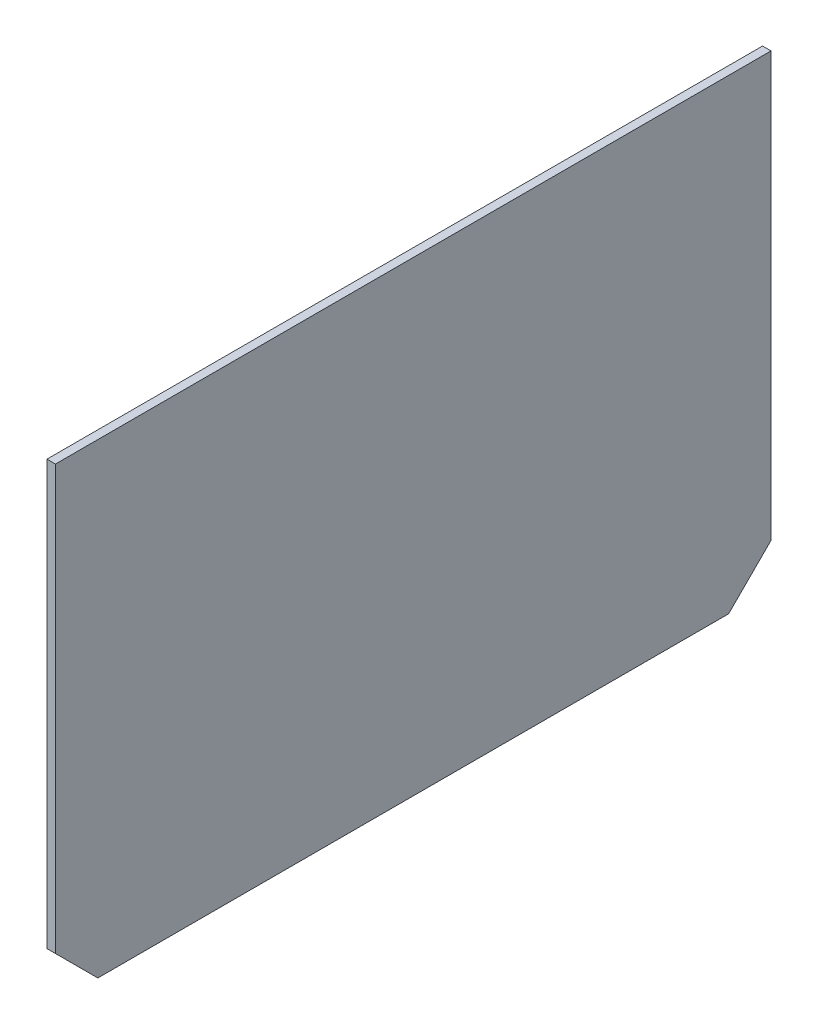
ISO-10303-21;
HEADER;
FILE_DESCRIPTION(('STEP AP214'),'2;1');
FILE_NAME('part.step','',(''),(''),'','','');
FILE_SCHEMA(('AUTOMOTIVE_DESIGN { 1 0 10303 214 1 1 1 1 }'));
ENDSEC;
DATA;
#1=APPLICATION_CONTEXT('core data for automotive mechanical design processes');
#2=APPLICATION_PROTOCOL_DEFINITION('international standard','automotive_design',2000,#1);
#3=PRODUCT_CONTEXT('',#1,'mechanical');
#4=PRODUCT('Part','Part','',(#3));
#5=PRODUCT_RELATED_PRODUCT_CATEGORY('part','',(#4));
#6=PRODUCT_DEFINITION_FORMATION('','',#4);
#7=PRODUCT_DEFINITION_CONTEXT('part definition',#1,'design');
#8=PRODUCT_DEFINITION('design','',#6,#7);
#9=PRODUCT_DEFINITION_SHAPE('','',#8);
#10=(LENGTH_UNIT() NAMED_UNIT(*) SI_UNIT(.MILLI.,.METRE.));
#11=(NAMED_UNIT(*) PLANE_ANGLE_UNIT() SI_UNIT($,.RADIAN.));
#12=(NAMED_UNIT(*) SI_UNIT($,.STERADIAN.) SOLID_ANGLE_UNIT());
#13=UNCERTAINTY_MEASURE_WITH_UNIT(LENGTH_MEASURE(1.E-05),#10,'distance_accuracy_value','');
#14=(GEOMETRIC_REPRESENTATION_CONTEXT(3) GLOBAL_UNCERTAINTY_ASSIGNED_CONTEXT((#13)) GLOBAL_UNIT_ASSIGNED_CONTEXT((#10,
#11,#12)) REPRESENTATION_CONTEXT('',''));
#15=CARTESIAN_POINT('',(0.,0.,0.));
#16=DIRECTION('',(0.,0.,1.));
#17=DIRECTION('',(1.,0.,0.));
#18=AXIS2_PLACEMENT_3D('',#15,#16,#17);
#19=CARTESIAN_POINT('',(-0.01,-137.507071067812,185.992928932188));
#20=DIRECTION('',(0.,-0.707106781186547,0.707106781186548));
#21=DIRECTION('',(1.,0.,0.));
#22=AXIS2_PLACEMENT_3D('',#19,#20,#21);
#23=PLANE('',#22);
#24=DIRECTION('',(0.,0.707106781186549,0.707106781186546));
#25=VECTOR('',#24,1.);
#26=CARTESIAN_POINT('',(0.,-137.5,186.));
#27=LINE('',#26,#25);
#28=CARTESIAN_POINT('',(0.,-137.5,186.));
#29=VERTEX_POINT('',#28);
#30=CARTESIAN_POINT('',(0.,-112.5,211.));
#31=VERTEX_POINT('',#30);
#32=EDGE_CURVE('E84',#29,#31,#27,.T.);
#33=ORIENTED_EDGE('',*,*,#32,.F.);
#34=DIRECTION('',(-1.,0.,0.));
#35=VECTOR('',#34,1.);
#36=CARTESIAN_POINT('',(2.5,-137.5,186.));
#37=LINE('',#36,#35);
#38=CARTESIAN_POINT('',(5.,-137.5,186.));
#39=VERTEX_POINT('',#38);
#40=EDGE_CURVE('E82',#39,#29,#37,.T.);
#41=ORIENTED_EDGE('',*,*,#40,.F.);
#42=DIRECTION('',(0.,-0.707106781186548,-0.707106781186547));
#43=VECTOR('',#42,1.);
#44=CARTESIAN_POINT('',(5.,-112.5,211.));
#45=LINE('',#44,#43);
#46=CARTESIAN_POINT('',(5.,-112.5,211.));
#47=VERTEX_POINT('',#46);
#48=EDGE_CURVE('E21',#47,#39,#45,.T.);
#49=ORIENTED_EDGE('',*,*,#48,.F.);
#50=DIRECTION('',(1.,0.,0.));
#51=VECTOR('',#50,1.);
#52=CARTESIAN_POINT('',(2.5,-112.5,211.));
#53=LINE('',#52,#51);
#54=EDGE_CURVE('E68',#31,#47,#53,.T.);
#55=ORIENTED_EDGE('',*,*,#54,.F.);
#56=EDGE_LOOP('',(#33,#41,#49,#55));
#57=FACE_BOUND('',#56,.T.);
#58=ADVANCED_FACE('F17',(#57),#23,.T.);
#59=CARTESIAN_POINT('',(-0.01,137.51,211.));
#60=DIRECTION('',(0.,0.,1.));
#61=DIRECTION('',(0.,-1.,0.));
#62=AXIS2_PLACEMENT_3D('',#59,#60,#61);
#63=PLANE('',#62);
#64=DIRECTION('',(1.,0.,0.));
#65=VECTOR('',#64,1.);
#66=CARTESIAN_POINT('',(2.5,137.5,211.));
#67=LINE('',#66,#65);
#68=CARTESIAN_POINT('',(0.,137.5,211.));
#69=VERTEX_POINT('',#68);
#70=CARTESIAN_POINT('',(5.,137.5,211.));
#71=VERTEX_POINT('',#70);
#72=EDGE_CURVE('E118',#69,#71,#67,.T.);
#73=ORIENTED_EDGE('',*,*,#72,.F.);
#74=DIRECTION('',(0.,1.,0.));
#75=VECTOR('',#74,1.);
#76=CARTESIAN_POINT('',(0.,0.,211.));
#77=LINE('',#76,#75);
#78=EDGE_CURVE('E97',#31,#69,#77,.T.);
#79=ORIENTED_EDGE('',*,*,#78,.F.);
#80=ORIENTED_EDGE('',*,*,#54,.T.);
#81=DIRECTION('',(0.,-1.,0.));
#82=VECTOR('',#81,1.);
#83=CARTESIAN_POINT('',(5.,0.,211.));
#84=LINE('',#83,#82);
#85=EDGE_CURVE('E79',#71,#47,#84,.T.);
#86=ORIENTED_EDGE('',*,*,#85,.F.);
#87=EDGE_LOOP('',(#73,#79,#80,#86));
#88=FACE_BOUND('',#87,.T.);
#89=ADVANCED_FACE('F125',(#88),#63,.T.);
#90=CARTESIAN_POINT('',(-0.01,137.5,-211.01));
#91=DIRECTION('',(0.,1.,0.));
#92=DIRECTION('',(0.,0.,1.));
#93=AXIS2_PLACEMENT_3D('',#90,#91,#92);
#94=PLANE('',#93);
#95=DIRECTION('',(0.,0.,1.));
#96=VECTOR('',#95,1.);
#97=CARTESIAN_POINT('',(5.,137.5,0.));
#98=LINE('',#97,#96);
#99=CARTESIAN_POINT('',(5.,137.5,-211.));
#100=VERTEX_POINT('',#99);
#101=EDGE_CURVE('E116',#100,#71,#98,.T.);
#102=ORIENTED_EDGE('',*,*,#101,.F.);
#103=DIRECTION('',(1.,0.,0.));
#104=VECTOR('',#103,1.);
#105=CARTESIAN_POINT('',(2.5,137.5,-211.));
#106=LINE('',#105,#104);
#107=CARTESIAN_POINT('',(0.,137.5,-211.));
#108=VERTEX_POINT('',#107);
#109=EDGE_CURVE('E111',#108,#100,#106,.T.);
#110=ORIENTED_EDGE('',*,*,#109,.F.);
#111=DIRECTION('',(0.,0.,-1.));
#112=VECTOR('',#111,1.);
#113=CARTESIAN_POINT('',(0.,137.5,0.));
#114=LINE('',#113,#112);
#115=EDGE_CURVE('E99',#69,#108,#114,.T.);
#116=ORIENTED_EDGE('',*,*,#115,.F.);
#117=ORIENTED_EDGE('',*,*,#72,.T.);
#118=EDGE_LOOP('',(#102,#110,#116,#117));
#119=FACE_BOUND('',#118,.T.);
#120=ADVANCED_FACE('F122',(#119),#94,.T.);
#121=CARTESIAN_POINT('',(5.,-137.51,211.01));
#122=DIRECTION('',(1.,0.,0.));
#123=DIRECTION('',(0.,0.,-1.));
#124=AXIS2_PLACEMENT_3D('',#121,#122,#123);
#125=PLANE('',#124);
#126=ORIENTED_EDGE('',*,*,#48,.T.);
#127=DIRECTION('',(0.,0.,1.));
#128=VECTOR('',#127,1.);
#129=CARTESIAN_POINT('',(5.,-137.5,0.));
#130=LINE('',#129,#128);
#131=CARTESIAN_POINT('',(5.,-137.5,-186.));
#132=VERTEX_POINT('',#131);
#133=EDGE_CURVE('E76',#132,#39,#130,.T.);
#134=ORIENTED_EDGE('',*,*,#133,.F.);
#135=DIRECTION('',(0.,-0.707106781186548,0.707106781186547));
#136=VECTOR('',#135,1.);
#137=CARTESIAN_POINT('',(5.,-125.,-198.5));
#138=LINE('',#137,#136);
#139=CARTESIAN_POINT('',(5.,-112.5,-211.));
#140=VERTEX_POINT('',#139);
#141=EDGE_CURVE('E104',#140,#132,#138,.T.);
#142=ORIENTED_EDGE('',*,*,#141,.F.);
#143=DIRECTION('',(0.,-1.,0.));
#144=VECTOR('',#143,1.);
#145=CARTESIAN_POINT('',(5.,12.5,-211.));
#146=LINE('',#145,#144);
#147=EDGE_CURVE('E106',#100,#140,#146,.T.);
#148=ORIENTED_EDGE('',*,*,#147,.F.);
#149=ORIENTED_EDGE('',*,*,#101,.T.);
#150=ORIENTED_EDGE('',*,*,#85,.T.);
#151=EDGE_LOOP('',(#126,#134,#142,#148,#149,#150));
#152=FACE_BOUND('',#151,.T.);
#153=ADVANCED_FACE('F74',(#152),#125,.T.);
#154=CARTESIAN_POINT('',(-0.01,-137.5,186.01));
#155=DIRECTION('',(0.,-1.,0.));
#156=DIRECTION('',(0.,0.,-1.));
#157=AXIS2_PLACEMENT_3D('',#154,#155,#156);
#158=PLANE('',#157);
#159=ORIENTED_EDGE('',*,*,#40,.T.);
#160=DIRECTION('',(0.,0.,1.));
#161=VECTOR('',#160,1.);
#162=CARTESIAN_POINT('',(0.,-137.5,0.));
#163=LINE('',#162,#161);
#164=CARTESIAN_POINT('',(0.,-137.5,-186.));
#165=VERTEX_POINT('',#164);
#166=EDGE_CURVE('E87',#165,#29,#163,.T.);
#167=ORIENTED_EDGE('',*,*,#166,.F.);
#168=DIRECTION('',(-1.,0.,0.));
#169=VECTOR('',#168,1.);
#170=CARTESIAN_POINT('',(2.5,-137.5,-186.));
#171=LINE('',#170,#169);
#172=EDGE_CURVE('E91',#132,#165,#171,.T.);
#173=ORIENTED_EDGE('',*,*,#172,.F.);
#174=ORIENTED_EDGE('',*,*,#133,.T.);
#175=EDGE_LOOP('',(#159,#167,#173,#174));
#176=FACE_BOUND('',#175,.T.);
#177=ADVANCED_FACE('F89',(#176),#158,.T.);
#178=CARTESIAN_POINT('',(0.,-137.51,-211.01));
#179=DIRECTION('',(-1.,0.,0.));
#180=DIRECTION('',(0.,0.,1.));
#181=AXIS2_PLACEMENT_3D('',#178,#179,#180);
#182=PLANE('',#181);
#183=ORIENTED_EDGE('',*,*,#115,.T.);
#184=DIRECTION('',(0.,1.,0.));
#185=VECTOR('',#184,1.);
#186=CARTESIAN_POINT('',(0.,12.5,-211.));
#187=LINE('',#186,#185);
#188=CARTESIAN_POINT('',(0.,-112.5,-211.));
#189=VERTEX_POINT('',#188);
#190=EDGE_CURVE('E36',#189,#108,#187,.T.);
#191=ORIENTED_EDGE('',*,*,#190,.F.);
#192=DIRECTION('',(0.,0.707106781186548,-0.707106781186547));
#193=VECTOR('',#192,1.);
#194=CARTESIAN_POINT('',(0.,-125.,-198.5));
#195=LINE('',#194,#193);
#196=EDGE_CURVE('E27',#165,#189,#195,.T.);
#197=ORIENTED_EDGE('',*,*,#196,.F.);
#198=ORIENTED_EDGE('',*,*,#166,.T.);
#199=ORIENTED_EDGE('',*,*,#32,.T.);
#200=ORIENTED_EDGE('',*,*,#78,.T.);
#201=EDGE_LOOP('',(#183,#191,#197,#198,#199,#200));
#202=FACE_BOUND('',#201,.T.);
#203=ADVANCED_FACE('F100',(#202),#182,.T.);
#204=CARTESIAN_POINT('',(-0.01,-112.51,-211.));
#205=DIRECTION('',(0.,0.,-1.));
#206=DIRECTION('',(0.,1.,0.));
#207=AXIS2_PLACEMENT_3D('',#204,#205,#206);
#208=PLANE('',#207);
#209=ORIENTED_EDGE('',*,*,#109,.T.);
#210=ORIENTED_EDGE('',*,*,#147,.T.);
#211=DIRECTION('',(1.,0.,0.));
#212=VECTOR('',#211,1.);
#213=CARTESIAN_POINT('',(2.5,-112.5,-211.));
#214=LINE('',#213,#212);
#215=EDGE_CURVE('E11',#189,#140,#214,.T.);
#216=ORIENTED_EDGE('',*,*,#215,.F.);
#217=ORIENTED_EDGE('',*,*,#190,.T.);
#218=EDGE_LOOP('',(#209,#210,#216,#217));
#219=FACE_BOUND('',#218,.T.);
#220=ADVANCED_FACE('F127',(#219),#208,.T.);
#221=CARTESIAN_POINT('',(5.01,-137.507071067812,-185.992928932188));
#222=DIRECTION('',(0.,-0.707106781186547,-0.707106781186548));
#223=DIRECTION('',(-1.,0.,0.));
#224=AXIS2_PLACEMENT_3D('',#221,#222,#223);
#225=PLANE('',#224);
#226=ORIENTED_EDGE('',*,*,#196,.T.);
#227=ORIENTED_EDGE('',*,*,#215,.T.);
#228=ORIENTED_EDGE('',*,*,#141,.T.);
#229=ORIENTED_EDGE('',*,*,#172,.T.);
#230=EDGE_LOOP('',(#226,#227,#228,#229));
#231=FACE_BOUND('',#230,.T.);
#232=ADVANCED_FACE('F19',(#231),#225,.T.);
#233=CLOSED_SHELL('',(#58,#89,#120,#153,#177,#203,#220,#232));
#234=MANIFOLD_SOLID_BREP('B1',#233);
#235=ADVANCED_BREP_SHAPE_REPRESENTATION('',(#18,#234),#14);
#236=SHAPE_DEFINITION_REPRESENTATION(#9,#235);
ENDSEC;
END-ISO-10303-21;
